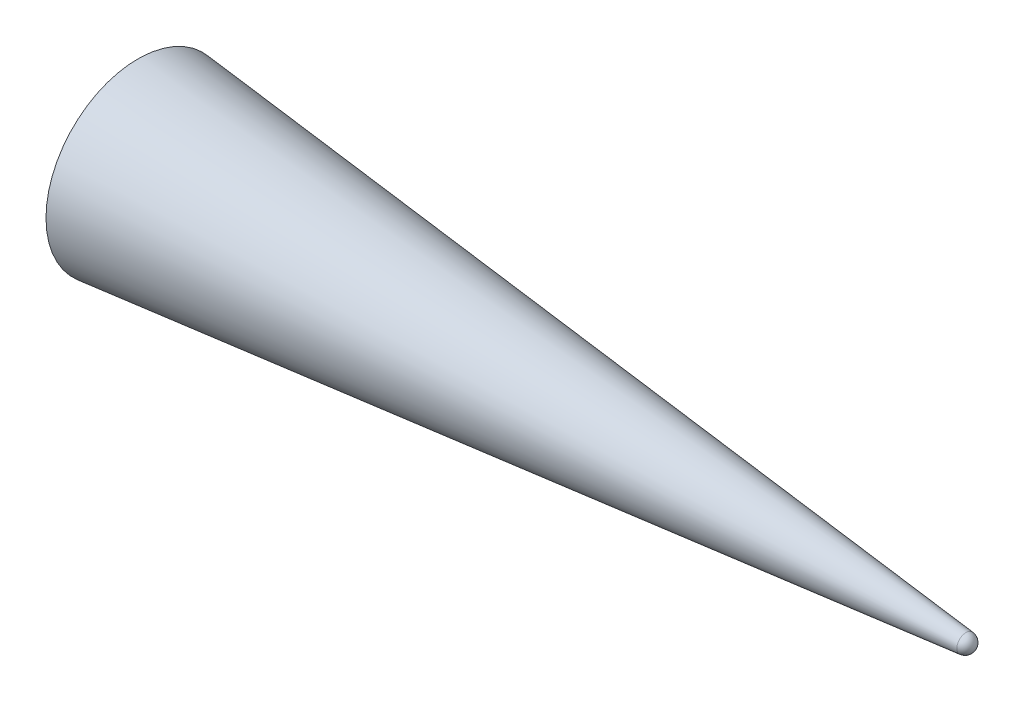
ISO-10303-21;
HEADER;
FILE_DESCRIPTION(('STEP AP214'),'2;1');
FILE_NAME('part.step','',(''),(''),'','','');
FILE_SCHEMA(('AUTOMOTIVE_DESIGN { 1 0 10303 214 1 1 1 1 }'));
ENDSEC;
DATA;
#1=APPLICATION_CONTEXT('core data for automotive mechanical design processes');
#2=APPLICATION_PROTOCOL_DEFINITION('international standard','automotive_design',2000,#1);
#3=PRODUCT_CONTEXT('',#1,'mechanical');
#4=PRODUCT('Part','Part','',(#3));
#5=PRODUCT_RELATED_PRODUCT_CATEGORY('part','',(#4));
#6=PRODUCT_DEFINITION_FORMATION('','',#4);
#7=PRODUCT_DEFINITION_CONTEXT('part definition',#1,'design');
#8=PRODUCT_DEFINITION('design','',#6,#7);
#9=PRODUCT_DEFINITION_SHAPE('','',#8);
#10=(LENGTH_UNIT() NAMED_UNIT(*) SI_UNIT(.MILLI.,.METRE.));
#11=(NAMED_UNIT(*) PLANE_ANGLE_UNIT() SI_UNIT($,.RADIAN.));
#12=(NAMED_UNIT(*) SI_UNIT($,.STERADIAN.) SOLID_ANGLE_UNIT());
#13=UNCERTAINTY_MEASURE_WITH_UNIT(LENGTH_MEASURE(1.E-05),#10,'distance_accuracy_value','');
#14=(GEOMETRIC_REPRESENTATION_CONTEXT(3) GLOBAL_UNCERTAINTY_ASSIGNED_CONTEXT((#13)) GLOBAL_UNIT_ASSIGNED_CONTEXT((#10,
#11,#12)) REPRESENTATION_CONTEXT('',''));
#15=CARTESIAN_POINT('',(0.,0.,0.));
#16=DIRECTION('',(0.,0.,1.));
#17=DIRECTION('',(1.,0.,0.));
#18=AXIS2_PLACEMENT_3D('',#15,#16,#17);
#19=CARTESIAN_POINT('',(0.,0.,0.));
#20=DIRECTION('',(1.,0.,0.));
#21=DIRECTION('',(0.,0.,-1.));
#22=AXIS2_PLACEMENT_3D('',#19,#20,#21);
#23=PLANE('',#22);
#24=CARTESIAN_POINT('',(0.,0.,0.));
#25=DIRECTION('',(-1.,0.,0.));
#26=DIRECTION('',(0.,0.,1.));
#27=AXIS2_PLACEMENT_3D('',#24,#25,#26);
#28=CIRCLE('',#27,100.);
#29=CARTESIAN_POINT('',(1.11022302462516E-13,0.,100.));
#30=VERTEX_POINT('',#29);
#31=EDGE_CURVE('E43',#30,#30,#28,.T.);
#32=ORIENTED_EDGE('',*,*,#31,.T.);
#33=EDGE_LOOP('',(#32));
#34=FACE_BOUND('',#33,.T.);
#35=ADVANCED_FACE('F37',(#34),#23,.F.);
#36=CARTESIAN_POINT('',(900.,0.,0.));
#37=DIRECTION('',(-1.,0.,0.));
#38=DIRECTION('',(0.,0.,-1.));
#39=AXIS2_PLACEMENT_3D('',#36,#37,#38);
#40=SPHERICAL_SURFACE('',#39,9.9503719020999);
#41=CARTESIAN_POINT('',(900.990099009901,0.,0.));
#42=DIRECTION('',(-1.,0.,0.));
#43=DIRECTION('',(0.,0.,1.));
#44=AXIS2_PLACEMENT_3D('',#41,#42,#43);
#45=CIRCLE('',#44,9.90099009900991);
#46=CARTESIAN_POINT('',(900.990099009901,0.,9.9009900990099));
#47=VERTEX_POINT('',#46);
#48=EDGE_CURVE('E10',#47,#47,#45,.T.);
#49=ORIENTED_EDGE('',*,*,#48,.F.);
#50=EDGE_LOOP('',(#49));
#51=FACE_BOUND('',#50,.T.);
#52=ADVANCED_FACE('F52',(#51),#40,.T.);
#53=CARTESIAN_POINT('',(900.990099009901,0.,0.));
#54=DIRECTION('',(-1.,0.,0.));
#55=DIRECTION('',(0.,0.,1.));
#56=AXIS2_PLACEMENT_3D('',#53,#54,#55);
#57=CONICAL_SURFACE('',#56,9.90099009900991,0.099668652491162);
#58=CARTESIAN_POINT('',(1.11022302462516E-13,0.,100.));
#59=CARTESIAN_POINT('',(9.38531353135327,0.,99.0614686468647));
#60=CARTESIAN_POINT('',(18.7706270627064,0.,98.1229372937294));
#61=CARTESIAN_POINT('',(37.5412541254127,0.,96.2458745874587));
#62=CARTESIAN_POINT('',(46.9265676567658,0.,95.3073432343234));
#63=CARTESIAN_POINT('',(65.697194719472,0.,93.4302805280528));
#64=CARTESIAN_POINT('',(75.0825082508251,0.,92.4917491749175));
#65=CARTESIAN_POINT('',(93.8531353135314,0.,90.6146864686469));
#66=CARTESIAN_POINT('',(103.238448844885,0.,89.6761551155116));
#67=CARTESIAN_POINT('',(122.009075907591,0.,87.7990924092409));
#68=CARTESIAN_POINT('',(131.394389438944,0.,86.8605610561056));
#69=CARTESIAN_POINT('',(150.16501650165,0.,84.983498349835));
#70=CARTESIAN_POINT('',(159.550330033003,0.,84.0449669966997));
#71=CARTESIAN_POINT('',(178.32095709571,0.,82.167904290429));
#72=CARTESIAN_POINT('',(187.706270627063,0.,81.2293729372937));
#73=CARTESIAN_POINT('',(206.476897689769,0.,79.3523102310231));
#74=CARTESIAN_POINT('',(215.862211221122,0.,78.4137788778878));
#75=CARTESIAN_POINT('',(234.632838283829,0.,76.5367161716172));
#76=CARTESIAN_POINT('',(244.018151815182,0.,75.5981848184819));
#77=CARTESIAN_POINT('',(262.788778877888,0.,73.7211221122112));
#78=CARTESIAN_POINT('',(272.174092409241,0.,72.7825907590759));
#79=CARTESIAN_POINT('',(290.944719471947,0.,70.9055280528053));
#80=CARTESIAN_POINT('',(300.3300330033,0.,69.96699669967));
#81=CARTESIAN_POINT('',(319.100660066007,0.,68.0899339933994));
#82=CARTESIAN_POINT('',(328.48597359736,0.,67.151402640264));
#83=CARTESIAN_POINT('',(347.256600660066,0.,65.2743399339934));
#84=CARTESIAN_POINT('',(356.641914191419,0.,64.3358085808581));
#85=CARTESIAN_POINT('',(375.412541254126,0.,62.4587458745875));
#86=CARTESIAN_POINT('',(384.797854785479,0.,61.5202145214521));
#87=CARTESIAN_POINT('',(403.568481848185,0.,59.6431518151815));
#88=CARTESIAN_POINT('',(412.953795379538,0.,58.7046204620462));
#89=CARTESIAN_POINT('',(431.724422442244,0.,56.8275577557756));
#90=CARTESIAN_POINT('',(441.109735973597,0.,55.8890264026403));
#91=CARTESIAN_POINT('',(459.880363036304,0.,54.0119636963696));
#92=CARTESIAN_POINT('',(469.265676567657,0.,53.0734323432343));
#93=CARTESIAN_POINT('',(488.036303630363,0.,51.1963696369637));
#94=CARTESIAN_POINT('',(497.421617161716,0.,50.2578382838284));
#95=CARTESIAN_POINT('',(516.192244224422,0.,48.3807755775578));
#96=CARTESIAN_POINT('',(525.577557755776,0.,47.4422442244225));
#97=CARTESIAN_POINT('',(544.348184818482,0.,45.5651815181518));
#98=CARTESIAN_POINT('',(553.733498349835,0.,44.6266501650165));
#99=CARTESIAN_POINT('',(572.504125412541,0.,42.7495874587459));
#100=CARTESIAN_POINT('',(581.889438943894,0.,41.8110561056106));
#101=CARTESIAN_POINT('',(600.660066006601,0.,39.9339933993399));
#102=CARTESIAN_POINT('',(610.045379537954,0.,38.9954620462046));
#103=CARTESIAN_POINT('',(628.81600660066,0.,37.118399339934));
#104=CARTESIAN_POINT('',(638.201320132013,0.,36.1798679867987));
#105=CARTESIAN_POINT('',(656.97194719472,0.,34.3028052805281));
#106=CARTESIAN_POINT('',(666.357260726073,0.,33.3642739273928));
#107=CARTESIAN_POINT('',(685.127887788779,0.,31.4872112211221));
#108=CARTESIAN_POINT('',(694.513201320132,0.,30.5486798679868));
#109=CARTESIAN_POINT('',(713.283828382838,0.,28.6716171617162));
#110=CARTESIAN_POINT('',(722.669141914192,0.,27.7330858085809));
#111=CARTESIAN_POINT('',(741.439768976898,0.,25.8560231023102));
#112=CARTESIAN_POINT('',(750.825082508251,0.,24.9174917491749));
#113=CARTESIAN_POINT('',(769.595709570957,0.,23.0404290429043));
#114=CARTESIAN_POINT('',(778.98102310231,0.,22.101897689769));
#115=CARTESIAN_POINT('',(797.751650165017,0.,20.2248349834984));
#116=CARTESIAN_POINT('',(807.13696369637,0.,19.286303630363));
#117=CARTESIAN_POINT('',(825.907590759076,0.,17.4092409240924));
#118=CARTESIAN_POINT('',(835.292904290429,0.,16.4707095709571));
#119=CARTESIAN_POINT('',(854.063531353135,0.,14.5936468646865));
#120=CARTESIAN_POINT('',(863.448844884488,0.,13.6551155115512));
#121=CARTESIAN_POINT('',(882.219471947195,0.,11.7780528052805));
#122=CARTESIAN_POINT('',(891.604785478548,0.,10.8395214521452));
#123=CARTESIAN_POINT('',(900.990099009901,0.,9.90099009900991));
#124=B_SPLINE_CURVE_WITH_KNOTS('',3,(#58,#59,#60,#61,#62,#63,#64,#65,#66,#67,#68,#69,#70,#71,
#72,#73,#74,#75,#76,#77,#78,#79,#80,#81,#82,#83,#84,#85,#86,#87,#88,#89,#90,#91,#92,#93,#94,#95,
#96,#97,#98,#99,#100,#101,#102,#103,#104,#105,#106,#107,#108,#109,#110,#111,#112,#113,#114,#115,
#116,#117,#118,#119,#120,#121,#122,#123),.UNSPECIFIED.,.F.,.F.,(4,2,2,2,2,2,2,2,2,2,2,2,2,2,2,2,
2,2,2,2,2,2,2,2,2,2,2,2,2,2,2,2,4),(0.,28.2963700965966,56.5927401931931,84.8891102897896,
113.185480386386,141.481850482983,169.778220579579,198.074590676176,226.370960772772,
254.667330869369,282.963700965966,311.260071062562,339.556441159159,367.852811255755,
396.149181352352,424.445551448949,452.741921545545,481.038291642142,509.334661738738,
537.631031835335,565.927401931931,594.223772028528,622.520142125124,650.816512221721,
679.112882318317,707.409252414914,735.70562251151,764.001992608107,792.298362704703,
820.5947328013,848.891102897897,877.187472994493,905.48384309109),.UNSPECIFIED.);
#125=EDGE_CURVE('BSEAM50',#30,#47,#124,.T.);
#126=ORIENTED_EDGE('',*,*,#31,.F.);
#127=ORIENTED_EDGE('',*,*,#48,.T.);
#128=ORIENTED_EDGE('',*,*,#125,.T.);
#129=ORIENTED_EDGE('',*,*,#125,.F.);
#130=EDGE_LOOP('',(#126,#128,#127,#129));
#131=FACE_BOUND('',#130,.T.);
#132=ADVANCED_FACE('F50',(#131),#57,.T.);
#133=CLOSED_SHELL('',(#35,#52,#132));
#134=MANIFOLD_SOLID_BREP('B2',#133);
#135=ADVANCED_BREP_SHAPE_REPRESENTATION('',(#18,#134),#14);
#136=SHAPE_DEFINITION_REPRESENTATION(#9,#135);
ENDSEC;
END-ISO-10303-21;
